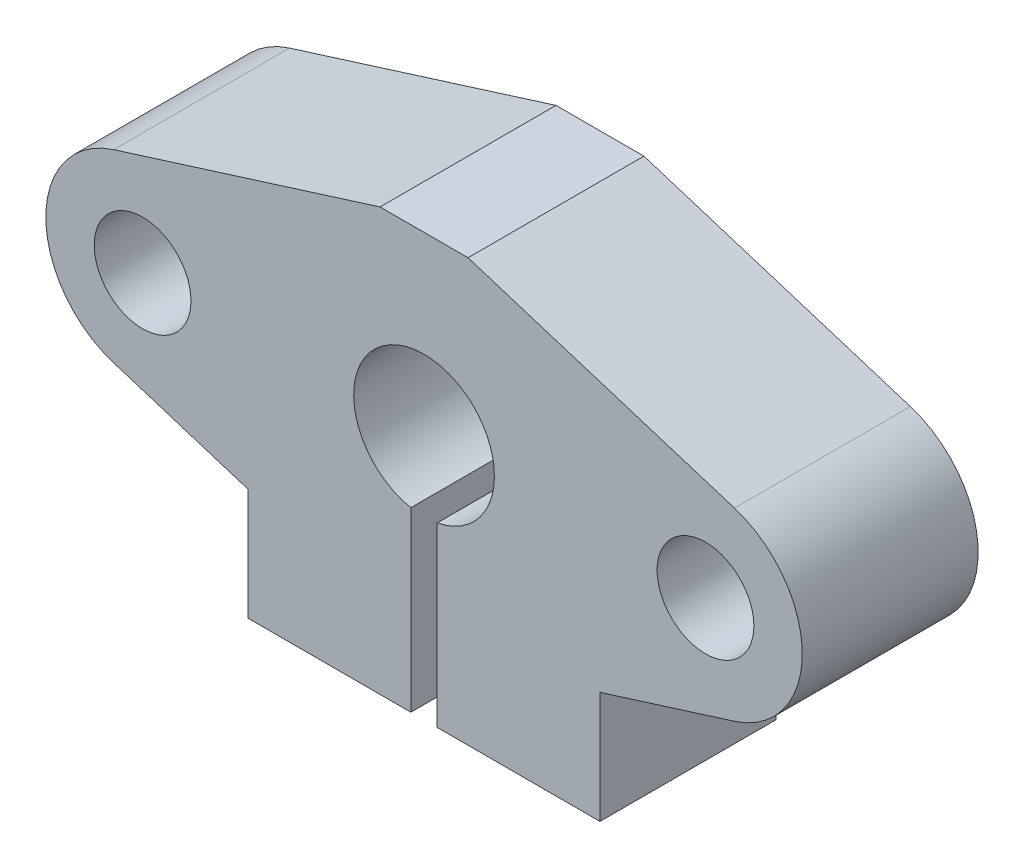
ISO-10303-21;
HEADER;
FILE_DESCRIPTION(('STEP AP214'),'2;1');
FILE_NAME('part.step','',(''),(''),'','','');
FILE_SCHEMA(('AUTOMOTIVE_DESIGN { 1 0 10303 214 1 1 1 1 }'));
ENDSEC;
DATA;
#1=APPLICATION_CONTEXT('core data for automotive mechanical design processes');
#2=APPLICATION_PROTOCOL_DEFINITION('international standard','automotive_design',2000,#1);
#3=PRODUCT_CONTEXT('',#1,'mechanical');
#4=PRODUCT('Part','Part','',(#3));
#5=PRODUCT_RELATED_PRODUCT_CATEGORY('part','',(#4));
#6=PRODUCT_DEFINITION_FORMATION('','',#4);
#7=PRODUCT_DEFINITION_CONTEXT('part definition',#1,'design');
#8=PRODUCT_DEFINITION('design','',#6,#7);
#9=PRODUCT_DEFINITION_SHAPE('','',#8);
#10=(LENGTH_UNIT() NAMED_UNIT(*) SI_UNIT(.MILLI.,.METRE.));
#11=(NAMED_UNIT(*) PLANE_ANGLE_UNIT() SI_UNIT($,.RADIAN.));
#12=(NAMED_UNIT(*) SI_UNIT($,.STERADIAN.) SOLID_ANGLE_UNIT());
#13=UNCERTAINTY_MEASURE_WITH_UNIT(LENGTH_MEASURE(1.E-05),#10,'distance_accuracy_value','');
#14=(GEOMETRIC_REPRESENTATION_CONTEXT(3) GLOBAL_UNCERTAINTY_ASSIGNED_CONTEXT((#13)) GLOBAL_UNIT_ASSIGNED_CONTEXT((#10,
#11,#12)) REPRESENTATION_CONTEXT('',''));
#15=CARTESIAN_POINT('',(0.,0.,0.));
#16=DIRECTION('',(0.,0.,1.));
#17=DIRECTION('',(1.,0.,0.));
#18=AXIS2_PLACEMENT_3D('',#15,#16,#17);
#19=CARTESIAN_POINT('',(-10.,-14.,-24.4131112314674));
#20=DIRECTION('',(0.,-1.,0.));
#21=DIRECTION('',(1.,0.,0.));
#22=AXIS2_PLACEMENT_3D('',#19,#20,#21);
#23=PLANE('',#22);
#24=DIRECTION('',(0.,0.,1.));
#25=VECTOR('',#24,1.);
#26=CARTESIAN_POINT('',(-0.749999999999997,-14.,-0.000999999999999265));
#27=LINE('',#26,#25);
#28=CARTESIAN_POINT('',(-0.749999999999997,-14.,0.));
#29=VERTEX_POINT('',#28);
#30=CARTESIAN_POINT('',(-0.749999999999997,-14.,10.));
#31=VERTEX_POINT('',#30);
#32=EDGE_CURVE('E136',#29,#31,#27,.T.);
#33=ORIENTED_EDGE('',*,*,#32,.T.);
#34=DIRECTION('',(1.,0.,0.));
#35=VECTOR('',#34,1.);
#36=CARTESIAN_POINT('',(-10.,-14.,10.));
#37=LINE('',#36,#35);
#38=CARTESIAN_POINT('',(-10.,-14.,10.));
#39=VERTEX_POINT('',#38);
#40=EDGE_CURVE('E147',#39,#31,#37,.T.);
#41=ORIENTED_EDGE('',*,*,#40,.F.);
#42=DIRECTION('',(0.,0.,1.));
#43=VECTOR('',#42,1.);
#44=CARTESIAN_POINT('',(-10.,-14.,-24.4131112314674));
#45=LINE('',#44,#43);
#46=CARTESIAN_POINT('',(-10.,-14.,0.));
#47=VERTEX_POINT('',#46);
#48=EDGE_CURVE('E161',#47,#39,#45,.T.);
#49=ORIENTED_EDGE('',*,*,#48,.F.);
#50=DIRECTION('',(-1.,0.,0.));
#51=VECTOR('',#50,1.);
#52=CARTESIAN_POINT('',(-10.,-14.,0.));
#53=LINE('',#52,#51);
#54=EDGE_CURVE('E148',#29,#47,#53,.T.);
#55=ORIENTED_EDGE('',*,*,#54,.F.);
#56=EDGE_LOOP('',(#33,#41,#49,#55));
#57=FACE_BOUND('',#56,.T.);
#58=ADVANCED_FACE('F34',(#57),#23,.T.);
#59=CARTESIAN_POINT('',(-16.,-1.16283847281329E-13,10.));
#60=DIRECTION('',(0.,0.,-1.));
#61=DIRECTION('',(-1.,0.,0.));
#62=AXIS2_PLACEMENT_3D('',#59,#60,#61);
#63=CYLINDRICAL_SURFACE('',#62,5.50000000000011);
#64=CARTESIAN_POINT('',(-16.,-1.16283847281329E-13,0.));
#65=DIRECTION('',(0.,0.,1.));
#66=DIRECTION('',(1.,0.,0.));
#67=AXIS2_PLACEMENT_3D('',#64,#65,#66);
#68=CIRCLE('',#67,5.50000000000011);
#69=CARTESIAN_POINT('',(-17.646494004079,5.24776690550686,0.));
#70=VERTEX_POINT('',#69);
#71=CARTESIAN_POINT('',(-17.646494004079,-5.24776690550686,0.));
#72=VERTEX_POINT('',#71);
#73=EDGE_CURVE('E179',#70,#72,#68,.T.);
#74=ORIENTED_EDGE('',*,*,#73,.T.);
#75=DIRECTION('',(0.,0.,-1.));
#76=VECTOR('',#75,1.);
#77=CARTESIAN_POINT('',(-17.646494004079,-5.24776690550686,10.));
#78=LINE('',#77,#76);
#79=CARTESIAN_POINT('',(-17.646494004079,-5.24776690550686,10.));
#80=VERTEX_POINT('',#79);
#81=EDGE_CURVE('E11',#80,#72,#78,.T.);
#82=ORIENTED_EDGE('',*,*,#81,.F.);
#83=CARTESIAN_POINT('',(-16.,-1.16283847281329E-13,10.));
#84=DIRECTION('',(0.,0.,1.));
#85=DIRECTION('',(1.,0.,0.));
#86=AXIS2_PLACEMENT_3D('',#83,#84,#85);
#87=CIRCLE('',#86,5.50000000000011);
#88=CARTESIAN_POINT('',(-17.646494004079,5.24776690550686,10.));
#89=VERTEX_POINT('',#88);
#90=EDGE_CURVE('E180',#89,#80,#87,.T.);
#91=ORIENTED_EDGE('',*,*,#90,.F.);
#92=DIRECTION('',(0.,0.,-1.));
#93=VECTOR('',#92,1.);
#94=CARTESIAN_POINT('',(-17.646494004079,5.24776690550686,10.));
#95=LINE('',#94,#93);
#96=EDGE_CURVE('E196',#89,#70,#95,.T.);
#97=ORIENTED_EDGE('',*,*,#96,.T.);
#98=EDGE_LOOP('',(#74,#82,#91,#97));
#99=FACE_BOUND('',#98,.T.);
#100=ADVANCED_FACE('F36',(#99),#63,.T.);
#101=CARTESIAN_POINT('',(-17.646494004079,-5.24776690550686,10.));
#102=DIRECTION('',(0.299362546196187,0.954139437364862,0.));
#103=DIRECTION('',(-0.954139437364862,0.299362546196187,0.));
#104=AXIS2_PLACEMENT_3D('',#101,#102,#103);
#105=PLANE('',#104);
#106=DIRECTION('',(0.954139437364862,-0.299362546196187,0.));
#107=VECTOR('',#106,1.);
#108=CARTESIAN_POINT('',(-17.646494004079,-5.24776690550686,0.));
#109=LINE('',#108,#107);
#110=CARTESIAN_POINT('',(-10.,-7.64686479926642,0.));
#111=VERTEX_POINT('',#110);
#112=EDGE_CURVE('E199',#72,#111,#109,.T.);
#113=ORIENTED_EDGE('',*,*,#112,.T.);
#114=DIRECTION('',(0.,0.,1.));
#115=VECTOR('',#114,1.);
#116=CARTESIAN_POINT('',(-10.,-7.64686479926642,10.));
#117=LINE('',#116,#115);
#118=CARTESIAN_POINT('',(-10.,-7.64686479926642,10.));
#119=VERTEX_POINT('',#118);
#120=EDGE_CURVE('E177',#111,#119,#117,.T.);
#121=ORIENTED_EDGE('',*,*,#120,.T.);
#122=DIRECTION('',(0.954139437364862,-0.299362546196187,0.));
#123=VECTOR('',#122,1.);
#124=CARTESIAN_POINT('',(-17.646494004079,-5.24776690550686,10.));
#125=LINE('',#124,#123);
#126=EDGE_CURVE('E183',#80,#119,#125,.T.);
#127=ORIENTED_EDGE('',*,*,#126,.F.);
#128=ORIENTED_EDGE('',*,*,#81,.T.);
#129=EDGE_LOOP('',(#113,#121,#127,#128));
#130=FACE_BOUND('',#129,.T.);
#131=ADVANCED_FACE('F303',(#130),#105,.F.);
#132=CARTESIAN_POINT('',(2.5,-10.,10.));
#133=DIRECTION('',(-0.299362546196187,0.954139437364862,0.));
#134=DIRECTION('',(-0.954139437364862,-0.299362546196187,0.));
#135=AXIS2_PLACEMENT_3D('',#132,#133,#134);
#136=PLANE('',#135);
#137=DIRECTION('',(0.954139437364862,0.299362546196187,0.));
#138=VECTOR('',#137,1.);
#139=CARTESIAN_POINT('',(2.5,-10.,10.));
#140=LINE('',#139,#138);
#141=CARTESIAN_POINT('',(10.,-7.64686479926642,10.));
#142=VERTEX_POINT('',#141);
#143=CARTESIAN_POINT('',(17.646494004079,-5.24776690550686,10.));
#144=VERTEX_POINT('',#143);
#145=EDGE_CURVE('E186',#142,#144,#140,.T.);
#146=ORIENTED_EDGE('',*,*,#145,.F.);
#147=DIRECTION('',(0.,0.,-1.));
#148=VECTOR('',#147,1.);
#149=CARTESIAN_POINT('',(10.,-7.64686479926642,10.));
#150=LINE('',#149,#148);
#151=CARTESIAN_POINT('',(10.,-7.64686479926642,0.));
#152=VERTEX_POINT('',#151);
#153=EDGE_CURVE('E174',#142,#152,#150,.T.);
#154=ORIENTED_EDGE('',*,*,#153,.T.);
#155=DIRECTION('',(0.954139437364862,0.299362546196187,0.));
#156=VECTOR('',#155,1.);
#157=CARTESIAN_POINT('',(2.5,-10.,0.));
#158=LINE('',#157,#156);
#159=CARTESIAN_POINT('',(17.646494004079,-5.24776690550686,0.));
#160=VERTEX_POINT('',#159);
#161=EDGE_CURVE('E201',#152,#160,#158,.T.);
#162=ORIENTED_EDGE('',*,*,#161,.T.);
#163=DIRECTION('',(0.,0.,-1.));
#164=VECTOR('',#163,1.);
#165=CARTESIAN_POINT('',(17.646494004079,-5.24776690550686,10.));
#166=LINE('',#165,#164);
#167=EDGE_CURVE('E42',#144,#160,#166,.T.);
#168=ORIENTED_EDGE('',*,*,#167,.F.);
#169=EDGE_LOOP('',(#146,#154,#162,#168));
#170=FACE_BOUND('',#169,.T.);
#171=ADVANCED_FACE('F246',(#170),#136,.F.);
#172=CARTESIAN_POINT('',(16.,-1.16283847281329E-13,10.));
#173=DIRECTION('',(0.,0.,-1.));
#174=DIRECTION('',(-1.,0.,0.));
#175=AXIS2_PLACEMENT_3D('',#172,#173,#174);
#176=CYLINDRICAL_SURFACE('',#175,5.50000000000011);
#177=CARTESIAN_POINT('',(16.,-1.16283847281329E-13,0.));
#178=DIRECTION('',(0.,0.,1.));
#179=DIRECTION('',(1.,0.,0.));
#180=AXIS2_PLACEMENT_3D('',#177,#178,#179);
#181=CIRCLE('',#180,5.50000000000011);
#182=CARTESIAN_POINT('',(17.646494004079,5.24776690550675,0.));
#183=VERTEX_POINT('',#182);
#184=EDGE_CURVE('E203',#160,#183,#181,.T.);
#185=ORIENTED_EDGE('',*,*,#184,.T.);
#186=DIRECTION('',(0.,0.,-1.));
#187=VECTOR('',#186,1.);
#188=CARTESIAN_POINT('',(17.646494004079,5.24776690550675,10.));
#189=LINE('',#188,#187);
#190=CARTESIAN_POINT('',(17.646494004079,5.24776690550675,10.));
#191=VERTEX_POINT('',#190);
#192=EDGE_CURVE('E218',#191,#183,#189,.T.);
#193=ORIENTED_EDGE('',*,*,#192,.F.);
#194=CARTESIAN_POINT('',(16.,-1.16283847281329E-13,10.));
#195=DIRECTION('',(0.,0.,1.));
#196=DIRECTION('',(1.,0.,0.));
#197=AXIS2_PLACEMENT_3D('',#194,#195,#196);
#198=CIRCLE('',#197,5.50000000000011);
#199=EDGE_CURVE('E188',#144,#191,#198,.T.);
#200=ORIENTED_EDGE('',*,*,#199,.F.);
#201=ORIENTED_EDGE('',*,*,#167,.T.);
#202=EDGE_LOOP('',(#185,#193,#200,#201));
#203=FACE_BOUND('',#202,.T.);
#204=ADVANCED_FACE('F225',(#203),#176,.T.);
#205=CARTESIAN_POINT('',(17.646494004079,5.24776690550686,10.));
#206=DIRECTION('',(-0.299362546196187,-0.954139437364862,0.));
#207=DIRECTION('',(0.954139437364862,-0.299362546196187,0.));
#208=AXIS2_PLACEMENT_3D('',#205,#206,#207);
#209=PLANE('',#208);
#210=DIRECTION('',(-0.954139437364862,0.299362546196187,0.));
#211=VECTOR('',#210,1.);
#212=CARTESIAN_POINT('',(17.646494004079,5.24776690550686,0.));
#213=LINE('',#212,#211);
#214=CARTESIAN_POINT('',(2.5,10.,0.));
#215=VERTEX_POINT('',#214);
#216=EDGE_CURVE('E205',#183,#215,#213,.T.);
#217=ORIENTED_EDGE('',*,*,#216,.T.);
#218=DIRECTION('',(0.,0.,-1.));
#219=VECTOR('',#218,1.);
#220=CARTESIAN_POINT('',(2.5,10.,10.));
#221=LINE('',#220,#219);
#222=CARTESIAN_POINT('',(2.5,10.,10.));
#223=VERTEX_POINT('',#222);
#224=EDGE_CURVE('E215',#223,#215,#221,.T.);
#225=ORIENTED_EDGE('',*,*,#224,.F.);
#226=DIRECTION('',(-0.954139437364862,0.299362546196187,0.));
#227=VECTOR('',#226,1.);
#228=CARTESIAN_POINT('',(17.646494004079,5.24776690550686,10.));
#229=LINE('',#228,#227);
#230=EDGE_CURVE('E190',#191,#223,#229,.T.);
#231=ORIENTED_EDGE('',*,*,#230,.F.);
#232=ORIENTED_EDGE('',*,*,#192,.T.);
#233=EDGE_LOOP('',(#217,#225,#231,#232));
#234=FACE_BOUND('',#233,.T.);
#235=ADVANCED_FACE('F236',(#234),#209,.F.);
#236=CARTESIAN_POINT('',(2.5,10.,10.));
#237=DIRECTION('',(0.,-1.,0.));
#238=DIRECTION('',(0.,0.,-1.));
#239=AXIS2_PLACEMENT_3D('',#236,#237,#238);
#240=PLANE('',#239);
#241=DIRECTION('',(-1.,0.,0.));
#242=VECTOR('',#241,1.);
#243=CARTESIAN_POINT('',(2.5,10.,0.));
#244=LINE('',#243,#242);
#245=CARTESIAN_POINT('',(-2.5,10.,0.));
#246=VERTEX_POINT('',#245);
#247=EDGE_CURVE('E207',#215,#246,#244,.T.);
#248=ORIENTED_EDGE('',*,*,#247,.T.);
#249=DIRECTION('',(0.,0.,-1.));
#250=VECTOR('',#249,1.);
#251=CARTESIAN_POINT('',(-2.5,10.,10.));
#252=LINE('',#251,#250);
#253=CARTESIAN_POINT('',(-2.5,10.,10.));
#254=VERTEX_POINT('',#253);
#255=EDGE_CURVE('E212',#254,#246,#252,.T.);
#256=ORIENTED_EDGE('',*,*,#255,.F.);
#257=DIRECTION('',(-1.,0.,0.));
#258=VECTOR('',#257,1.);
#259=CARTESIAN_POINT('',(2.5,10.,10.));
#260=LINE('',#259,#258);
#261=EDGE_CURVE('E192',#223,#254,#260,.T.);
#262=ORIENTED_EDGE('',*,*,#261,.F.);
#263=ORIENTED_EDGE('',*,*,#224,.T.);
#264=EDGE_LOOP('',(#248,#256,#262,#263));
#265=FACE_BOUND('',#264,.T.);
#266=ADVANCED_FACE('F240',(#265),#240,.F.);
#267=CARTESIAN_POINT('',(-2.5,10.,10.));
#268=DIRECTION('',(0.299362546196187,-0.954139437364862,0.));
#269=DIRECTION('',(0.954139437364862,0.299362546196187,0.));
#270=AXIS2_PLACEMENT_3D('',#267,#268,#269);
#271=PLANE('',#270);
#272=DIRECTION('',(-0.954139437364862,-0.299362546196187,0.));
#273=VECTOR('',#272,1.);
#274=CARTESIAN_POINT('',(-2.5,10.,0.));
#275=LINE('',#274,#273);
#276=EDGE_CURVE('E184',#246,#70,#275,.T.);
#277=ORIENTED_EDGE('',*,*,#276,.T.);
#278=ORIENTED_EDGE('',*,*,#96,.F.);
#279=DIRECTION('',(-0.954139437364862,-0.299362546196187,0.));
#280=VECTOR('',#279,1.);
#281=CARTESIAN_POINT('',(-2.5,10.,10.));
#282=LINE('',#281,#280);
#283=EDGE_CURVE('E194',#254,#89,#282,.T.);
#284=ORIENTED_EDGE('',*,*,#283,.F.);
#285=ORIENTED_EDGE('',*,*,#255,.T.);
#286=EDGE_LOOP('',(#277,#278,#284,#285));
#287=FACE_BOUND('',#286,.T.);
#288=ADVANCED_FACE('F323',(#287),#271,.F.);
#289=CARTESIAN_POINT('',(-16.,-1.16283847281329E-13,10.));
#290=DIRECTION('',(0.,0.,1.));
#291=DIRECTION('',(1.,0.,0.));
#292=AXIS2_PLACEMENT_3D('',#289,#290,#291);
#293=PLANE('',#292);
#294=DIRECTION('',(0.,-1.,0.));
#295=VECTOR('',#294,1.);
#296=CARTESIAN_POINT('',(-0.749999999999999,0.,10.));
#297=LINE('',#296,#295);
#298=CARTESIAN_POINT('',(-0.749999999999999,-3.92905841137543,10.));
#299=VERTEX_POINT('',#298);
#300=EDGE_CURVE('E133',#299,#31,#297,.T.);
#301=ORIENTED_EDGE('',*,*,#300,.F.);
#302=CARTESIAN_POINT('',(0.,0.,10.));
#303=DIRECTION('',(0.,0.,1.));
#304=DIRECTION('',(1.,0.,0.));
#305=AXIS2_PLACEMENT_3D('',#302,#303,#304);
#306=CIRCLE('',#305,4.);
#307=CARTESIAN_POINT('',(0.75,-3.92905841137543,10.));
#308=VERTEX_POINT('',#307);
#309=EDGE_CURVE('E259',#308,#299,#306,.T.);
#310=ORIENTED_EDGE('',*,*,#309,.F.);
#311=DIRECTION('',(0.,1.,0.));
#312=VECTOR('',#311,1.);
#313=CARTESIAN_POINT('',(0.749999999999999,0.,10.));
#314=LINE('',#313,#312);
#315=CARTESIAN_POINT('',(0.750000000000003,-14.,10.));
#316=VERTEX_POINT('',#315);
#317=EDGE_CURVE('E57',#316,#308,#314,.T.);
#318=ORIENTED_EDGE('',*,*,#317,.F.);
#319=CARTESIAN_POINT('',(10.,-14.,10.));
#320=VERTEX_POINT('',#319);
#321=EDGE_CURVE('E158',#316,#320,#37,.T.);
#322=ORIENTED_EDGE('',*,*,#321,.T.);
#323=DIRECTION('',(0.,1.,0.));
#324=VECTOR('',#323,1.);
#325=CARTESIAN_POINT('',(10.,0.,10.));
#326=LINE('',#325,#324);
#327=EDGE_CURVE('E157',#320,#142,#326,.T.);
#328=ORIENTED_EDGE('',*,*,#327,.T.);
#329=ORIENTED_EDGE('',*,*,#145,.T.);
#330=ORIENTED_EDGE('',*,*,#199,.T.);
#331=ORIENTED_EDGE('',*,*,#230,.T.);
#332=ORIENTED_EDGE('',*,*,#261,.T.);
#333=ORIENTED_EDGE('',*,*,#283,.T.);
#334=ORIENTED_EDGE('',*,*,#90,.T.);
#335=ORIENTED_EDGE('',*,*,#126,.T.);
#336=DIRECTION('',(0.,-1.,0.));
#337=VECTOR('',#336,1.);
#338=CARTESIAN_POINT('',(-10.,0.,10.));
#339=LINE('',#338,#337);
#340=EDGE_CURVE('E155',#119,#39,#339,.T.);
#341=ORIENTED_EDGE('',*,*,#340,.T.);
#342=ORIENTED_EDGE('',*,*,#40,.T.);
#343=EDGE_LOOP('',(#301,#310,#318,#322,#328,#329,#330,#331,#332,#333,#334,#335,#341,#342));
#344=FACE_BOUND('',#343,.T.);
#345=CARTESIAN_POINT('',(16.,0.,10.));
#346=DIRECTION('',(0.,0.,1.));
#347=DIRECTION('',(1.,0.,0.));
#348=AXIS2_PLACEMENT_3D('',#345,#346,#347);
#349=CIRCLE('',#348,2.75);
#350=CARTESIAN_POINT('',(18.75,0.,10.));
#351=VERTEX_POINT('',#350);
#352=EDGE_CURVE('E266',#351,#351,#349,.T.);
#353=ORIENTED_EDGE('',*,*,#352,.F.);
#354=EDGE_LOOP('',(#353));
#355=FACE_BOUND('',#354,.T.);
#356=CARTESIAN_POINT('',(-16.,0.,10.));
#357=DIRECTION('',(0.,0.,1.));
#358=DIRECTION('',(1.,0.,0.));
#359=AXIS2_PLACEMENT_3D('',#356,#357,#358);
#360=CIRCLE('',#359,2.75);
#361=CARTESIAN_POINT('',(-13.25,0.,10.));
#362=VERTEX_POINT('',#361);
#363=EDGE_CURVE('E265',#362,#362,#360,.T.);
#364=ORIENTED_EDGE('',*,*,#363,.F.);
#365=EDGE_LOOP('',(#364));
#366=FACE_BOUND('',#365,.T.);
#367=ADVANCED_FACE('F151',(#344,#355,#366),#293,.T.);
#368=CARTESIAN_POINT('',(-16.,-1.16283847281329E-13,0.));
#369=DIRECTION('',(0.,0.,1.));
#370=DIRECTION('',(1.,0.,0.));
#371=AXIS2_PLACEMENT_3D('',#368,#369,#370);
#372=PLANE('',#371);
#373=CARTESIAN_POINT('',(16.,0.,0.));
#374=DIRECTION('',(0.,0.,1.));
#375=DIRECTION('',(1.,0.,0.));
#376=AXIS2_PLACEMENT_3D('',#373,#374,#375);
#377=CIRCLE('',#376,2.75);
#378=CARTESIAN_POINT('',(18.75,0.,0.));
#379=VERTEX_POINT('',#378);
#380=EDGE_CURVE('E262',#379,#379,#377,.F.);
#381=ORIENTED_EDGE('',*,*,#380,.F.);
#382=EDGE_LOOP('',(#381));
#383=FACE_BOUND('',#382,.T.);
#384=CARTESIAN_POINT('',(-16.,0.,0.));
#385=DIRECTION('',(0.,0.,1.));
#386=DIRECTION('',(1.,0.,0.));
#387=AXIS2_PLACEMENT_3D('',#384,#385,#386);
#388=CIRCLE('',#387,2.75);
#389=CARTESIAN_POINT('',(-13.25,0.,0.));
#390=VERTEX_POINT('',#389);
#391=EDGE_CURVE('E261',#390,#390,#388,.F.);
#392=ORIENTED_EDGE('',*,*,#391,.F.);
#393=EDGE_LOOP('',(#392));
#394=FACE_BOUND('',#393,.T.);
#395=CARTESIAN_POINT('',(0.,0.,0.));
#396=DIRECTION('',(0.,0.,1.));
#397=DIRECTION('',(1.,0.,0.));
#398=AXIS2_PLACEMENT_3D('',#395,#396,#397);
#399=CIRCLE('',#398,4.);
#400=CARTESIAN_POINT('',(-0.749999999999999,-3.92905841137543,0.));
#401=VERTEX_POINT('',#400);
#402=CARTESIAN_POINT('',(0.75,-3.92905841137543,0.));
#403=VERTEX_POINT('',#402);
#404=EDGE_CURVE('E256',#401,#403,#399,.F.);
#405=ORIENTED_EDGE('',*,*,#404,.F.);
#406=DIRECTION('',(0.,1.,0.));
#407=VECTOR('',#406,1.);
#408=CARTESIAN_POINT('',(-0.749999999999999,0.,0.));
#409=LINE('',#408,#407);
#410=EDGE_CURVE('E49',#29,#401,#409,.T.);
#411=ORIENTED_EDGE('',*,*,#410,.F.);
#412=ORIENTED_EDGE('',*,*,#54,.T.);
#413=DIRECTION('',(0.,1.,0.));
#414=VECTOR('',#413,1.);
#415=CARTESIAN_POINT('',(-10.,0.,0.));
#416=LINE('',#415,#414);
#417=EDGE_CURVE('E252',#47,#111,#416,.T.);
#418=ORIENTED_EDGE('',*,*,#417,.T.);
#419=ORIENTED_EDGE('',*,*,#112,.F.);
#420=ORIENTED_EDGE('',*,*,#73,.F.);
#421=ORIENTED_EDGE('',*,*,#276,.F.);
#422=ORIENTED_EDGE('',*,*,#247,.F.);
#423=ORIENTED_EDGE('',*,*,#216,.F.);
#424=ORIENTED_EDGE('',*,*,#184,.F.);
#425=ORIENTED_EDGE('',*,*,#161,.F.);
#426=DIRECTION('',(0.,-1.,0.));
#427=VECTOR('',#426,1.);
#428=CARTESIAN_POINT('',(10.,0.,0.));
#429=LINE('',#428,#427);
#430=CARTESIAN_POINT('',(10.,-14.,0.));
#431=VERTEX_POINT('',#430);
#432=EDGE_CURVE('E169',#152,#431,#429,.T.);
#433=ORIENTED_EDGE('',*,*,#432,.T.);
#434=CARTESIAN_POINT('',(0.750000000000003,-14.,0.));
#435=VERTEX_POINT('',#434);
#436=EDGE_CURVE('E171',#431,#435,#53,.T.);
#437=ORIENTED_EDGE('',*,*,#436,.T.);
#438=DIRECTION('',(0.,-1.,0.));
#439=VECTOR('',#438,1.);
#440=CARTESIAN_POINT('',(0.749999999999999,0.,0.));
#441=LINE('',#440,#439);
#442=EDGE_CURVE('E276',#403,#435,#441,.T.);
#443=ORIENTED_EDGE('',*,*,#442,.F.);
#444=EDGE_LOOP('',(#405,#411,#412,#418,#419,#420,#421,#422,#423,#424,#425,#433,#437,#443));
#445=FACE_BOUND('',#444,.T.);
#446=ADVANCED_FACE('F231',(#383,#394,#445),#372,.F.);
#447=CARTESIAN_POINT('',(-10.,0.,-24.4131112314674));
#448=DIRECTION('',(-1.,0.,0.));
#449=DIRECTION('',(0.,-1.,0.));
#450=AXIS2_PLACEMENT_3D('',#447,#448,#449);
#451=PLANE('',#450);
#452=ORIENTED_EDGE('',*,*,#120,.F.);
#453=ORIENTED_EDGE('',*,*,#417,.F.);
#454=ORIENTED_EDGE('',*,*,#48,.T.);
#455=ORIENTED_EDGE('',*,*,#340,.F.);
#456=EDGE_LOOP('',(#452,#453,#454,#455));
#457=FACE_BOUND('',#456,.T.);
#458=ADVANCED_FACE('F296',(#457),#451,.T.);
#459=CARTESIAN_POINT('',(10.,0.,-24.4131112314674));
#460=DIRECTION('',(1.,0.,0.));
#461=DIRECTION('',(0.,1.,0.));
#462=AXIS2_PLACEMENT_3D('',#459,#460,#461);
#463=PLANE('',#462);
#464=ORIENTED_EDGE('',*,*,#153,.F.);
#465=ORIENTED_EDGE('',*,*,#327,.F.);
#466=DIRECTION('',(0.,0.,1.));
#467=VECTOR('',#466,1.);
#468=CARTESIAN_POINT('',(10.,-14.,-24.4131112314674));
#469=LINE('',#468,#467);
#470=EDGE_CURVE('E166',#431,#320,#469,.T.);
#471=ORIENTED_EDGE('',*,*,#470,.F.);
#472=ORIENTED_EDGE('',*,*,#432,.F.);
#473=EDGE_LOOP('',(#464,#465,#471,#472));
#474=FACE_BOUND('',#473,.T.);
#475=ADVANCED_FACE('F249',(#474),#463,.T.);
#476=DIRECTION('',(0.,0.,1.));
#477=VECTOR('',#476,1.);
#478=CARTESIAN_POINT('',(0.750000000000003,-14.,-0.000999999999999265));
#479=LINE('',#478,#477);
#480=EDGE_CURVE('E149',#435,#316,#479,.T.);
#481=ORIENTED_EDGE('',*,*,#480,.F.);
#482=ORIENTED_EDGE('',*,*,#436,.F.);
#483=ORIENTED_EDGE('',*,*,#470,.T.);
#484=ORIENTED_EDGE('',*,*,#321,.F.);
#485=EDGE_LOOP('',(#481,#482,#483,#484));
#486=FACE_BOUND('',#485,.T.);
#487=ADVANCED_FACE('F287',(#486),#23,.T.);
#488=CARTESIAN_POINT('',(0.,0.,-0.000999999999999265));
#489=DIRECTION('',(0.,0.,1.));
#490=DIRECTION('',(1.,0.,0.));
#491=AXIS2_PLACEMENT_3D('',#488,#489,#490);
#492=CYLINDRICAL_SURFACE('',#491,4.);
#493=ORIENTED_EDGE('',*,*,#309,.T.);
#494=DIRECTION('',(0.,0.,1.));
#495=VECTOR('',#494,1.);
#496=CARTESIAN_POINT('',(-0.749999999999999,-3.92905841137543,-0.000999999999999265));
#497=LINE('',#496,#495);
#498=EDGE_CURVE('E137',#401,#299,#497,.T.);
#499=ORIENTED_EDGE('',*,*,#498,.F.);
#500=ORIENTED_EDGE('',*,*,#404,.T.);
#501=DIRECTION('',(0.,0.,1.));
#502=VECTOR('',#501,1.);
#503=CARTESIAN_POINT('',(0.75,-3.92905841137543,-0.000999999999999265));
#504=LINE('',#503,#502);
#505=EDGE_CURVE('E279',#308,#403,#504,.F.);
#506=ORIENTED_EDGE('',*,*,#505,.F.);
#507=EDGE_LOOP('',(#493,#499,#500,#506));
#508=FACE_BOUND('',#507,.T.);
#509=ADVANCED_FACE('F284',(#508),#492,.F.);
#510=CARTESIAN_POINT('',(-16.,0.,-0.000999999999999265));
#511=DIRECTION('',(0.,0.,1.));
#512=DIRECTION('',(1.,0.,0.));
#513=AXIS2_PLACEMENT_3D('',#510,#511,#512);
#514=CYLINDRICAL_SURFACE('',#513,2.75);
#515=ORIENTED_EDGE('',*,*,#363,.T.);
#516=EDGE_LOOP('',(#515));
#517=FACE_BOUND('',#516,.T.);
#518=ORIENTED_EDGE('',*,*,#391,.T.);
#519=EDGE_LOOP('',(#518));
#520=FACE_BOUND('',#519,.T.);
#521=ADVANCED_FACE('F294',(#517,#520),#514,.F.);
#522=CARTESIAN_POINT('',(16.,0.,-0.000999999999999265));
#523=DIRECTION('',(0.,0.,1.));
#524=DIRECTION('',(1.,0.,0.));
#525=AXIS2_PLACEMENT_3D('',#522,#523,#524);
#526=CYLINDRICAL_SURFACE('',#525,2.75);
#527=ORIENTED_EDGE('',*,*,#352,.T.);
#528=EDGE_LOOP('',(#527));
#529=FACE_BOUND('',#528,.T.);
#530=ORIENTED_EDGE('',*,*,#380,.T.);
#531=EDGE_LOOP('',(#530));
#532=FACE_BOUND('',#531,.T.);
#533=ADVANCED_FACE('F387',(#529,#532),#526,.F.);
#534=CARTESIAN_POINT('',(0.749999999999999,0.,-0.000999999999999265));
#535=DIRECTION('',(1.,0.,0.));
#536=DIRECTION('',(0.,1.,0.));
#537=AXIS2_PLACEMENT_3D('',#534,#535,#536);
#538=PLANE('',#537);
#539=ORIENTED_EDGE('',*,*,#442,.T.);
#540=ORIENTED_EDGE('',*,*,#480,.T.);
#541=ORIENTED_EDGE('',*,*,#317,.T.);
#542=ORIENTED_EDGE('',*,*,#505,.T.);
#543=EDGE_LOOP('',(#539,#540,#541,#542));
#544=FACE_BOUND('',#543,.T.);
#545=ADVANCED_FACE('F281',(#544),#538,.F.);
#546=CARTESIAN_POINT('',(-0.749999999999999,0.,-0.000999999999999265));
#547=DIRECTION('',(-1.,0.,0.));
#548=DIRECTION('',(0.,-1.,0.));
#549=AXIS2_PLACEMENT_3D('',#546,#547,#548);
#550=PLANE('',#549);
#551=ORIENTED_EDGE('',*,*,#410,.T.);
#552=ORIENTED_EDGE('',*,*,#498,.T.);
#553=ORIENTED_EDGE('',*,*,#300,.T.);
#554=ORIENTED_EDGE('',*,*,#32,.F.);
#555=EDGE_LOOP('',(#551,#552,#553,#554));
#556=FACE_BOUND('',#555,.T.);
#557=ADVANCED_FACE('F135',(#556),#550,.F.);
#558=CLOSED_SHELL('',(#58,#100,#131,#171,#204,#235,#266,#288,#367,#446,#458,#475,#487,#509,#521,
#533,#545,#557));
#559=MANIFOLD_SOLID_BREP('B2',#558);
#560=ADVANCED_BREP_SHAPE_REPRESENTATION('',(#18,#559),#14);
#561=SHAPE_DEFINITION_REPRESENTATION(#9,#560);
ENDSEC;
END-ISO-10303-21;
